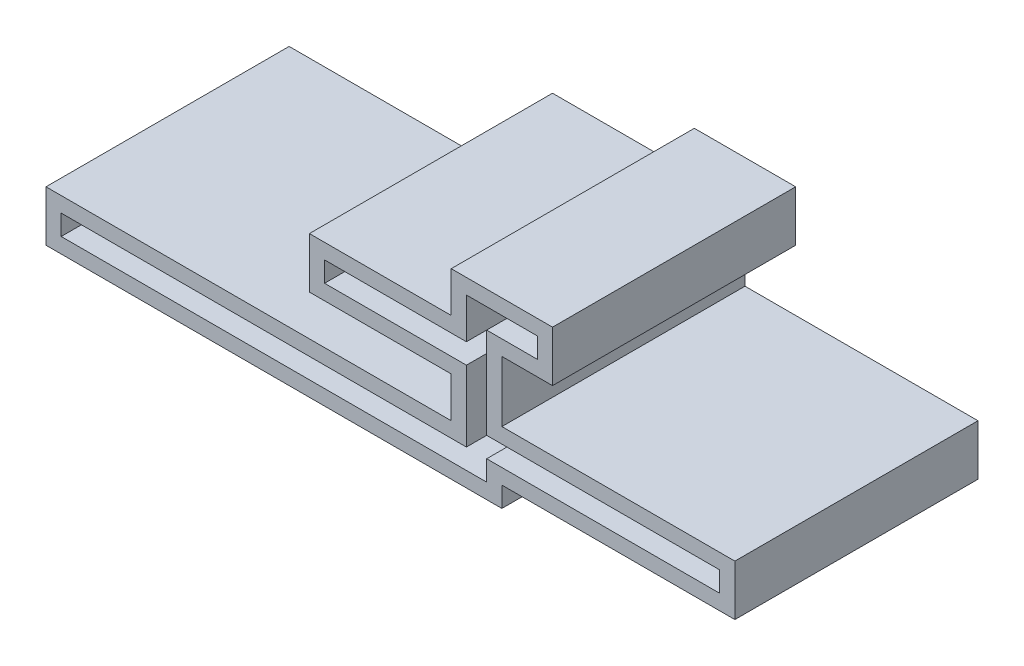
ISO-10303-21;
HEADER;
FILE_DESCRIPTION(('STEP AP214'),'2;1');
FILE_NAME('part.step','',(''),(''),'','','');
FILE_SCHEMA(('AUTOMOTIVE_DESIGN { 1 0 10303 214 1 1 1 1 }'));
ENDSEC;
DATA;
#1=APPLICATION_CONTEXT('core data for automotive mechanical design processes');
#2=APPLICATION_PROTOCOL_DEFINITION('international standard','automotive_design',2000,#1);
#3=PRODUCT_CONTEXT('',#1,'mechanical');
#4=PRODUCT('Part','Part','',(#3));
#5=PRODUCT_RELATED_PRODUCT_CATEGORY('part','',(#4));
#6=PRODUCT_DEFINITION_FORMATION('','',#4);
#7=PRODUCT_DEFINITION_CONTEXT('part definition',#1,'design');
#8=PRODUCT_DEFINITION('design','',#6,#7);
#9=PRODUCT_DEFINITION_SHAPE('','',#8);
#10=(LENGTH_UNIT() NAMED_UNIT(*) SI_UNIT(.MILLI.,.METRE.));
#11=(NAMED_UNIT(*) PLANE_ANGLE_UNIT() SI_UNIT($,.RADIAN.));
#12=(NAMED_UNIT(*) SI_UNIT($,.STERADIAN.) SOLID_ANGLE_UNIT());
#13=UNCERTAINTY_MEASURE_WITH_UNIT(LENGTH_MEASURE(1.E-05),#10,'distance_accuracy_value','');
#14=(GEOMETRIC_REPRESENTATION_CONTEXT(3) GLOBAL_UNCERTAINTY_ASSIGNED_CONTEXT((#13)) GLOBAL_UNIT_ASSIGNED_CONTEXT((#10,
#11,#12)) REPRESENTATION_CONTEXT('',''));
#15=CARTESIAN_POINT('',(0.,0.,0.));
#16=DIRECTION('',(0.,0.,1.));
#17=DIRECTION('',(1.,0.,0.));
#18=AXIS2_PLACEMENT_3D('',#15,#16,#17);
#19=CARTESIAN_POINT('',(-63.4999999999997,228.6,304.8));
#20=DIRECTION('',(1.,0.,0.));
#21=DIRECTION('',(0.,1.,0.));
#22=AXIS2_PLACEMENT_3D('',#19,#20,#21);
#23=PLANE('',#22);
#24=DIRECTION('',(0.,-1.,0.));
#25=VECTOR('',#24,1.);
#26=CARTESIAN_POINT('',(-63.4999999999997,228.6,0.));
#27=LINE('',#26,#25);
#28=CARTESIAN_POINT('',(-63.4999999999997,228.6,0.));
#29=VERTEX_POINT('',#28);
#30=CARTESIAN_POINT('',(-63.4999999999997,177.8,0.));
#31=VERTEX_POINT('',#30);
#32=EDGE_CURVE('E190',#29,#31,#27,.T.);
#33=ORIENTED_EDGE('',*,*,#32,.T.);
#34=DIRECTION('',(0.,0.,-1.));
#35=VECTOR('',#34,1.);
#36=CARTESIAN_POINT('',(-63.4999999999997,177.8,304.8));
#37=LINE('',#36,#35);
#38=CARTESIAN_POINT('',(-63.4999999999997,177.8,304.8));
#39=VERTEX_POINT('',#38);
#40=EDGE_CURVE('E11',#39,#31,#37,.T.);
#41=ORIENTED_EDGE('',*,*,#40,.F.);
#42=DIRECTION('',(0.,-1.,0.));
#43=VECTOR('',#42,1.);
#44=CARTESIAN_POINT('',(-63.4999999999997,228.6,304.8));
#45=LINE('',#44,#43);
#46=CARTESIAN_POINT('',(-63.4999999999997,228.6,304.8));
#47=VERTEX_POINT('',#46);
#48=EDGE_CURVE('E222',#47,#39,#45,.T.);
#49=ORIENTED_EDGE('',*,*,#48,.F.);
#50=DIRECTION('',(0.,0.,-1.));
#51=VECTOR('',#50,1.);
#52=CARTESIAN_POINT('',(-63.4999999999997,228.6,304.8));
#53=LINE('',#52,#51);
#54=EDGE_CURVE('E186',#47,#29,#53,.T.);
#55=ORIENTED_EDGE('',*,*,#54,.T.);
#56=EDGE_LOOP('',(#33,#41,#49,#55));
#57=FACE_BOUND('',#56,.T.);
#58=ADVANCED_FACE('F35',(#57),#23,.F.);
#59=CARTESIAN_POINT('',(-241.3,177.8,304.8));
#60=DIRECTION('',(0.,-1.,0.));
#61=DIRECTION('',(0.,0.,-1.));
#62=AXIS2_PLACEMENT_3D('',#59,#60,#61);
#63=PLANE('',#62);
#64=DIRECTION('',(-1.,0.,0.));
#65=VECTOR('',#64,1.);
#66=CARTESIAN_POINT('',(-241.3,177.8,0.));
#67=LINE('',#66,#65);
#68=CARTESIAN_POINT('',(-241.3,177.8,0.));
#69=VERTEX_POINT('',#68);
#70=EDGE_CURVE('E193',#31,#69,#67,.T.);
#71=ORIENTED_EDGE('',*,*,#70,.T.);
#72=DIRECTION('',(0.,0.,-1.));
#73=VECTOR('',#72,1.);
#74=CARTESIAN_POINT('',(-241.3,177.8,304.8));
#75=LINE('',#74,#73);
#76=CARTESIAN_POINT('',(-241.3,177.8,304.8));
#77=VERTEX_POINT('',#76);
#78=EDGE_CURVE('E42',#77,#69,#75,.T.);
#79=ORIENTED_EDGE('',*,*,#78,.F.);
#80=DIRECTION('',(-1.,0.,0.));
#81=VECTOR('',#80,1.);
#82=CARTESIAN_POINT('',(-241.3,177.8,304.8));
#83=LINE('',#82,#81);
#84=EDGE_CURVE('E123',#39,#77,#83,.T.);
#85=ORIENTED_EDGE('',*,*,#84,.F.);
#86=ORIENTED_EDGE('',*,*,#40,.T.);
#87=EDGE_LOOP('',(#71,#79,#85,#86));
#88=FACE_BOUND('',#87,.T.);
#89=ADVANCED_FACE('F553',(#88),#63,.F.);
#90=CARTESIAN_POINT('',(-241.3,114.3,304.8));
#91=DIRECTION('',(1.,0.,0.));
#92=DIRECTION('',(0.,0.,-1.));
#93=AXIS2_PLACEMENT_3D('',#90,#91,#92);
#94=PLANE('',#93);
#95=DIRECTION('',(0.,-1.,0.));
#96=VECTOR('',#95,1.);
#97=CARTESIAN_POINT('',(-241.3,114.3,0.));
#98=LINE('',#97,#96);
#99=CARTESIAN_POINT('',(-241.3,114.3,0.));
#100=VERTEX_POINT('',#99);
#101=EDGE_CURVE('E196',#69,#100,#98,.T.);
#102=ORIENTED_EDGE('',*,*,#101,.T.);
#103=DIRECTION('',(0.,0.,-1.));
#104=VECTOR('',#103,1.);
#105=CARTESIAN_POINT('',(-241.3,114.3,304.8));
#106=LINE('',#105,#104);
#107=CARTESIAN_POINT('',(-241.3,114.3,304.8));
#108=VERTEX_POINT('',#107);
#109=EDGE_CURVE('E253',#108,#100,#106,.T.);
#110=ORIENTED_EDGE('',*,*,#109,.F.);
#111=DIRECTION('',(0.,-1.,0.));
#112=VECTOR('',#111,1.);
#113=CARTESIAN_POINT('',(-241.3,114.3,304.8));
#114=LINE('',#113,#112);
#115=EDGE_CURVE('E261',#77,#108,#114,.T.);
#116=ORIENTED_EDGE('',*,*,#115,.F.);
#117=ORIENTED_EDGE('',*,*,#78,.T.);
#118=EDGE_LOOP('',(#102,#110,#116,#117));
#119=FACE_BOUND('',#118,.T.);
#120=ADVANCED_FACE('F259',(#119),#94,.F.);
#121=CARTESIAN_POINT('',(-63.5,114.3,304.8));
#122=DIRECTION('',(0.,1.,0.));
#123=DIRECTION('',(-1.,0.,0.));
#124=AXIS2_PLACEMENT_3D('',#121,#122,#123);
#125=PLANE('',#124);
#126=DIRECTION('',(1.,0.,0.));
#127=VECTOR('',#126,1.);
#128=CARTESIAN_POINT('',(-63.5,114.3,0.));
#129=LINE('',#128,#127);
#130=CARTESIAN_POINT('',(-63.5,114.3,0.));
#131=VERTEX_POINT('',#130);
#132=EDGE_CURVE('E198',#100,#131,#129,.T.);
#133=ORIENTED_EDGE('',*,*,#132,.T.);
#134=DIRECTION('',(0.,0.,-1.));
#135=VECTOR('',#134,1.);
#136=CARTESIAN_POINT('',(-63.5,114.3,304.8));
#137=LINE('',#136,#135);
#138=CARTESIAN_POINT('',(-63.5,114.3,304.8));
#139=VERTEX_POINT('',#138);
#140=EDGE_CURVE('E250',#139,#131,#137,.T.);
#141=ORIENTED_EDGE('',*,*,#140,.F.);
#142=DIRECTION('',(1.,0.,0.));
#143=VECTOR('',#142,1.);
#144=CARTESIAN_POINT('',(-63.5,114.3,304.8));
#145=LINE('',#144,#143);
#146=EDGE_CURVE('E279',#108,#139,#145,.T.);
#147=ORIENTED_EDGE('',*,*,#146,.F.);
#148=ORIENTED_EDGE('',*,*,#109,.T.);
#149=EDGE_LOOP('',(#133,#141,#147,#148));
#150=FACE_BOUND('',#149,.T.);
#151=ADVANCED_FACE('F270',(#150),#125,.F.);
#152=CARTESIAN_POINT('',(-63.5,63.4999999999999,304.8));
#153=DIRECTION('',(1.,0.,0.));
#154=DIRECTION('',(0.,1.,0.));
#155=AXIS2_PLACEMENT_3D('',#152,#153,#154);
#156=PLANE('',#155);
#157=DIRECTION('',(0.,-1.,0.));
#158=VECTOR('',#157,1.);
#159=CARTESIAN_POINT('',(-63.5,63.4999999999999,0.));
#160=LINE('',#159,#158);
#161=CARTESIAN_POINT('',(-63.5,63.4999999999999,0.));
#162=VERTEX_POINT('',#161);
#163=EDGE_CURVE('E200',#131,#162,#160,.T.);
#164=ORIENTED_EDGE('',*,*,#163,.T.);
#165=DIRECTION('',(0.,0.,-1.));
#166=VECTOR('',#165,1.);
#167=CARTESIAN_POINT('',(-63.5,63.4999999999999,304.8));
#168=LINE('',#167,#166);
#169=CARTESIAN_POINT('',(-63.5,63.4999999999999,304.8));
#170=VERTEX_POINT('',#169);
#171=EDGE_CURVE('E247',#170,#162,#168,.T.);
#172=ORIENTED_EDGE('',*,*,#171,.F.);
#173=DIRECTION('',(0.,-1.,0.));
#174=VECTOR('',#173,1.);
#175=CARTESIAN_POINT('',(-63.5,63.4999999999999,304.8));
#176=LINE('',#175,#174);
#177=EDGE_CURVE('E276',#139,#170,#176,.T.);
#178=ORIENTED_EDGE('',*,*,#177,.F.);
#179=ORIENTED_EDGE('',*,*,#140,.T.);
#180=EDGE_LOOP('',(#164,#172,#178,#179));
#181=FACE_BOUND('',#180,.T.);
#182=ADVANCED_FACE('F274',(#181),#156,.F.);
#183=CARTESIAN_POINT('',(-571.5,63.5,304.8));
#184=DIRECTION('',(0.,-1.,0.));
#185=DIRECTION('',(1.,0.,0.));
#186=AXIS2_PLACEMENT_3D('',#183,#184,#185);
#187=PLANE('',#186);
#188=DIRECTION('',(-1.,0.,0.));
#189=VECTOR('',#188,1.);
#190=CARTESIAN_POINT('',(-571.5,63.5,0.));
#191=LINE('',#190,#189);
#192=CARTESIAN_POINT('',(-571.5,63.5,0.));
#193=VERTEX_POINT('',#192);
#194=EDGE_CURVE('E202',#162,#193,#191,.T.);
#195=ORIENTED_EDGE('',*,*,#194,.T.);
#196=DIRECTION('',(0.,0.,-1.));
#197=VECTOR('',#196,1.);
#198=CARTESIAN_POINT('',(-571.5,63.5,304.8));
#199=LINE('',#198,#197);
#200=CARTESIAN_POINT('',(-571.5,63.5,304.8));
#201=VERTEX_POINT('',#200);
#202=EDGE_CURVE('E244',#201,#193,#199,.T.);
#203=ORIENTED_EDGE('',*,*,#202,.F.);
#204=DIRECTION('',(-1.,0.,0.));
#205=VECTOR('',#204,1.);
#206=CARTESIAN_POINT('',(-571.5,63.5,304.8));
#207=LINE('',#206,#205);
#208=EDGE_CURVE('E278',#170,#201,#207,.T.);
#209=ORIENTED_EDGE('',*,*,#208,.F.);
#210=ORIENTED_EDGE('',*,*,#171,.T.);
#211=EDGE_LOOP('',(#195,#203,#209,#210));
#212=FACE_BOUND('',#211,.T.);
#213=ADVANCED_FACE('F566',(#212),#187,.F.);
#214=CARTESIAN_POINT('',(-571.5,0.,304.8));
#215=DIRECTION('',(1.,0.,0.));
#216=DIRECTION('',(0.,0.,-1.));
#217=AXIS2_PLACEMENT_3D('',#214,#215,#216);
#218=PLANE('',#217);
#219=DIRECTION('',(0.,-1.,0.));
#220=VECTOR('',#219,1.);
#221=CARTESIAN_POINT('',(-571.5,0.,0.));
#222=LINE('',#221,#220);
#223=CARTESIAN_POINT('',(-571.5,0.,0.));
#224=VERTEX_POINT('',#223);
#225=EDGE_CURVE('E204',#193,#224,#222,.T.);
#226=ORIENTED_EDGE('',*,*,#225,.T.);
#227=DIRECTION('',(0.,0.,-1.));
#228=VECTOR('',#227,1.);
#229=CARTESIAN_POINT('',(-571.5,0.,304.8));
#230=LINE('',#229,#228);
#231=CARTESIAN_POINT('',(-571.5,0.,304.8));
#232=VERTEX_POINT('',#231);
#233=EDGE_CURVE('E241',#232,#224,#230,.T.);
#234=ORIENTED_EDGE('',*,*,#233,.F.);
#235=DIRECTION('',(0.,-1.,0.));
#236=VECTOR('',#235,1.);
#237=CARTESIAN_POINT('',(-571.5,0.,304.8));
#238=LINE('',#237,#236);
#239=EDGE_CURVE('E281',#201,#232,#238,.T.);
#240=ORIENTED_EDGE('',*,*,#239,.F.);
#241=ORIENTED_EDGE('',*,*,#202,.T.);
#242=EDGE_LOOP('',(#226,#234,#240,#241));
#243=FACE_BOUND('',#242,.T.);
#244=ADVANCED_FACE('F569',(#243),#218,.F.);
#245=CARTESIAN_POINT('',(0.,0.,304.8));
#246=DIRECTION('',(0.,1.,0.));
#247=DIRECTION('',(-1.,0.,0.));
#248=AXIS2_PLACEMENT_3D('',#245,#246,#247);
#249=PLANE('',#248);
#250=DIRECTION('',(1.,0.,0.));
#251=VECTOR('',#250,1.);
#252=CARTESIAN_POINT('',(0.,0.,0.));
#253=LINE('',#252,#251);
#254=CARTESIAN_POINT('',(0.,0.,0.));
#255=VERTEX_POINT('',#254);
#256=EDGE_CURVE('E206',#224,#255,#253,.T.);
#257=ORIENTED_EDGE('',*,*,#256,.T.);
#258=DIRECTION('',(0.,0.,-1.));
#259=VECTOR('',#258,1.);
#260=CARTESIAN_POINT('',(0.,0.,304.8));
#261=LINE('',#260,#259);
#262=CARTESIAN_POINT('',(0.,0.,304.8));
#263=VERTEX_POINT('',#262);
#264=EDGE_CURVE('E238',#263,#255,#261,.T.);
#265=ORIENTED_EDGE('',*,*,#264,.F.);
#266=DIRECTION('',(1.,0.,0.));
#267=VECTOR('',#266,1.);
#268=CARTESIAN_POINT('',(0.,0.,304.8));
#269=LINE('',#268,#267);
#270=EDGE_CURVE('E287',#232,#263,#269,.T.);
#271=ORIENTED_EDGE('',*,*,#270,.F.);
#272=ORIENTED_EDGE('',*,*,#233,.T.);
#273=EDGE_LOOP('',(#257,#265,#271,#272));
#274=FACE_BOUND('',#273,.T.);
#275=ADVANCED_FACE('F573',(#274),#249,.F.);
#276=CARTESIAN_POINT('',(2.61464941302539E-13,25.3999999999999,304.8));
#277=DIRECTION('',(-1.,0.,0.));
#278=DIRECTION('',(0.,-1.,0.));
#279=AXIS2_PLACEMENT_3D('',#276,#277,#278);
#280=PLANE('',#279);
#281=DIRECTION('',(0.,1.,0.));
#282=VECTOR('',#281,1.);
#283=CARTESIAN_POINT('',(2.61464941302539E-13,25.3999999999999,0.));
#284=LINE('',#283,#282);
#285=CARTESIAN_POINT('',(2.61464941302539E-13,25.3999999999999,0.));
#286=VERTEX_POINT('',#285);
#287=EDGE_CURVE('E208',#255,#286,#284,.T.);
#288=ORIENTED_EDGE('',*,*,#287,.T.);
#289=DIRECTION('',(0.,0.,-1.));
#290=VECTOR('',#289,1.);
#291=CARTESIAN_POINT('',(2.61464941302539E-13,25.3999999999999,304.8));
#292=LINE('',#291,#290);
#293=CARTESIAN_POINT('',(2.61464941302539E-13,25.3999999999999,304.8));
#294=VERTEX_POINT('',#293);
#295=EDGE_CURVE('E235',#294,#286,#292,.T.);
#296=ORIENTED_EDGE('',*,*,#295,.F.);
#297=DIRECTION('',(0.,1.,0.));
#298=VECTOR('',#297,1.);
#299=CARTESIAN_POINT('',(2.61464941302539E-13,25.3999999999999,304.8));
#300=LINE('',#299,#298);
#301=EDGE_CURVE('E289',#263,#294,#300,.T.);
#302=ORIENTED_EDGE('',*,*,#301,.F.);
#303=ORIENTED_EDGE('',*,*,#264,.T.);
#304=EDGE_LOOP('',(#288,#296,#302,#303));
#305=FACE_BOUND('',#304,.T.);
#306=ADVANCED_FACE('F577',(#305),#280,.F.);
#307=CARTESIAN_POINT('',(292.1,25.3999999999999,304.8));
#308=DIRECTION('',(0.,1.,0.));
#309=DIRECTION('',(-1.,0.,0.));
#310=AXIS2_PLACEMENT_3D('',#307,#308,#309);
#311=PLANE('',#310);
#312=DIRECTION('',(1.,0.,0.));
#313=VECTOR('',#312,1.);
#314=CARTESIAN_POINT('',(292.1,25.3999999999999,0.));
#315=LINE('',#314,#313);
#316=CARTESIAN_POINT('',(292.1,25.3999999999999,0.));
#317=VERTEX_POINT('',#316);
#318=EDGE_CURVE('E210',#286,#317,#315,.T.);
#319=ORIENTED_EDGE('',*,*,#318,.T.);
#320=DIRECTION('',(0.,0.,-1.));
#321=VECTOR('',#320,1.);
#322=CARTESIAN_POINT('',(292.1,25.3999999999999,304.8));
#323=LINE('',#322,#321);
#324=CARTESIAN_POINT('',(292.1,25.3999999999999,304.8));
#325=VERTEX_POINT('',#324);
#326=EDGE_CURVE('E232',#325,#317,#323,.T.);
#327=ORIENTED_EDGE('',*,*,#326,.F.);
#328=DIRECTION('',(1.,0.,0.));
#329=VECTOR('',#328,1.);
#330=CARTESIAN_POINT('',(292.1,25.3999999999999,304.8));
#331=LINE('',#330,#329);
#332=EDGE_CURVE('E291',#294,#325,#331,.T.);
#333=ORIENTED_EDGE('',*,*,#332,.F.);
#334=ORIENTED_EDGE('',*,*,#295,.T.);
#335=EDGE_LOOP('',(#319,#327,#333,#334));
#336=FACE_BOUND('',#335,.T.);
#337=ADVANCED_FACE('F581',(#336),#311,.F.);
#338=CARTESIAN_POINT('',(292.1,88.8999999999999,304.8));
#339=DIRECTION('',(-1.,0.,0.));
#340=DIRECTION('',(0.,-1.,0.));
#341=AXIS2_PLACEMENT_3D('',#338,#339,#340);
#342=PLANE('',#341);
#343=DIRECTION('',(0.,1.,0.));
#344=VECTOR('',#343,1.);
#345=CARTESIAN_POINT('',(292.1,88.8999999999999,0.));
#346=LINE('',#345,#344);
#347=CARTESIAN_POINT('',(292.1,88.8999999999999,0.));
#348=VERTEX_POINT('',#347);
#349=EDGE_CURVE('E212',#317,#348,#346,.T.);
#350=ORIENTED_EDGE('',*,*,#349,.T.);
#351=DIRECTION('',(0.,0.,-1.));
#352=VECTOR('',#351,1.);
#353=CARTESIAN_POINT('',(292.1,88.8999999999999,304.8));
#354=LINE('',#353,#352);
#355=CARTESIAN_POINT('',(292.1,88.8999999999999,304.8));
#356=VERTEX_POINT('',#355);
#357=EDGE_CURVE('E229',#356,#348,#354,.T.);
#358=ORIENTED_EDGE('',*,*,#357,.F.);
#359=DIRECTION('',(0.,1.,0.));
#360=VECTOR('',#359,1.);
#361=CARTESIAN_POINT('',(292.1,88.8999999999999,304.8));
#362=LINE('',#361,#360);
#363=EDGE_CURVE('E293',#325,#356,#362,.T.);
#364=ORIENTED_EDGE('',*,*,#363,.F.);
#365=ORIENTED_EDGE('',*,*,#326,.T.);
#366=EDGE_LOOP('',(#350,#358,#364,#365));
#367=FACE_BOUND('',#366,.T.);
#368=ADVANCED_FACE('F585',(#367),#342,.F.);
#369=CARTESIAN_POINT('',(2.53688434127953E-13,88.8999999999999,304.8));
#370=DIRECTION('',(0.,-1.,0.));
#371=DIRECTION('',(1.,0.,0.));
#372=AXIS2_PLACEMENT_3D('',#369,#370,#371);
#373=PLANE('',#372);
#374=DIRECTION('',(-1.,0.,0.));
#375=VECTOR('',#374,1.);
#376=CARTESIAN_POINT('',(2.53688434127953E-13,88.8999999999999,0.));
#377=LINE('',#376,#375);
#378=CARTESIAN_POINT('',(2.53688434127953E-13,88.8999999999999,0.));
#379=VERTEX_POINT('',#378);
#380=EDGE_CURVE('E214',#348,#379,#377,.T.);
#381=ORIENTED_EDGE('',*,*,#380,.T.);
#382=DIRECTION('',(0.,0.,-1.));
#383=VECTOR('',#382,1.);
#384=CARTESIAN_POINT('',(2.53688434127953E-13,88.8999999999999,304.8));
#385=LINE('',#384,#383);
#386=CARTESIAN_POINT('',(2.53688434127953E-13,88.8999999999999,304.8));
#387=VERTEX_POINT('',#386);
#388=EDGE_CURVE('E226',#387,#379,#385,.T.);
#389=ORIENTED_EDGE('',*,*,#388,.F.);
#390=DIRECTION('',(-1.,0.,0.));
#391=VECTOR('',#390,1.);
#392=CARTESIAN_POINT('',(2.53688434127953E-13,88.8999999999999,304.8));
#393=LINE('',#392,#391);
#394=EDGE_CURVE('E295',#356,#387,#393,.T.);
#395=ORIENTED_EDGE('',*,*,#394,.F.);
#396=ORIENTED_EDGE('',*,*,#357,.T.);
#397=EDGE_LOOP('',(#381,#389,#395,#396));
#398=FACE_BOUND('',#397,.T.);
#399=ADVANCED_FACE('F301',(#398),#373,.F.);
#400=CARTESIAN_POINT('',(2.4435662551845E-13,165.1,304.8));
#401=DIRECTION('',(-1.,0.,0.));
#402=DIRECTION('',(0.,-1.,0.));
#403=AXIS2_PLACEMENT_3D('',#400,#401,#402);
#404=PLANE('',#403);
#405=DIRECTION('',(0.,1.,0.));
#406=VECTOR('',#405,1.);
#407=CARTESIAN_POINT('',(2.4435662551845E-13,165.1,0.));
#408=LINE('',#407,#406);
#409=CARTESIAN_POINT('',(2.4435662551845E-13,165.1,0.));
#410=VERTEX_POINT('',#409);
#411=EDGE_CURVE('E216',#379,#410,#408,.T.);
#412=ORIENTED_EDGE('',*,*,#411,.T.);
#413=DIRECTION('',(0.,0.,-1.));
#414=VECTOR('',#413,1.);
#415=CARTESIAN_POINT('',(2.4435662551845E-13,165.1,304.8));
#416=LINE('',#415,#414);
#417=CARTESIAN_POINT('',(2.4435662551845E-13,165.1,304.8));
#418=VERTEX_POINT('',#417);
#419=EDGE_CURVE('E181',#418,#410,#416,.T.);
#420=ORIENTED_EDGE('',*,*,#419,.F.);
#421=DIRECTION('',(0.,1.,0.));
#422=VECTOR('',#421,1.);
#423=CARTESIAN_POINT('',(2.4435662551845E-13,165.1,304.8));
#424=LINE('',#423,#422);
#425=EDGE_CURVE('E169',#387,#418,#424,.T.);
#426=ORIENTED_EDGE('',*,*,#425,.F.);
#427=ORIENTED_EDGE('',*,*,#388,.T.);
#428=EDGE_LOOP('',(#412,#420,#426,#427));
#429=FACE_BOUND('',#428,.T.);
#430=ADVANCED_FACE('F305',(#429),#404,.F.);
#431=CARTESIAN_POINT('',(63.5000000000003,165.1,304.8));
#432=DIRECTION('',(0.,1.,0.));
#433=DIRECTION('',(-1.,0.,0.));
#434=AXIS2_PLACEMENT_3D('',#431,#432,#433);
#435=PLANE('',#434);
#436=DIRECTION('',(1.,0.,0.));
#437=VECTOR('',#436,1.);
#438=CARTESIAN_POINT('',(63.5000000000003,165.1,0.));
#439=LINE('',#438,#437);
#440=CARTESIAN_POINT('',(63.5000000000003,165.1,0.));
#441=VERTEX_POINT('',#440);
#442=EDGE_CURVE('E178',#410,#441,#439,.T.);
#443=ORIENTED_EDGE('',*,*,#442,.T.);
#444=DIRECTION('',(0.,0.,-1.));
#445=VECTOR('',#444,1.);
#446=CARTESIAN_POINT('',(63.5000000000003,165.1,304.8));
#447=LINE('',#446,#445);
#448=CARTESIAN_POINT('',(63.5000000000003,165.1,304.8));
#449=VERTEX_POINT('',#448);
#450=EDGE_CURVE('E175',#449,#441,#447,.T.);
#451=ORIENTED_EDGE('',*,*,#450,.F.);
#452=DIRECTION('',(1.,0.,0.));
#453=VECTOR('',#452,1.);
#454=CARTESIAN_POINT('',(63.5000000000003,165.1,304.8));
#455=LINE('',#454,#453);
#456=EDGE_CURVE('E162',#418,#449,#455,.T.);
#457=ORIENTED_EDGE('',*,*,#456,.F.);
#458=ORIENTED_EDGE('',*,*,#419,.T.);
#459=EDGE_LOOP('',(#443,#451,#457,#458));
#460=FACE_BOUND('',#459,.T.);
#461=ADVANCED_FACE('F176',(#460),#435,.F.);
#462=CARTESIAN_POINT('',(63.5000000000003,228.6,304.8));
#463=DIRECTION('',(-1.,0.,0.));
#464=DIRECTION('',(0.,-1.,0.));
#465=AXIS2_PLACEMENT_3D('',#462,#463,#464);
#466=PLANE('',#465);
#467=DIRECTION('',(0.,1.,0.));
#468=VECTOR('',#467,1.);
#469=CARTESIAN_POINT('',(63.5000000000003,228.6,0.));
#470=LINE('',#469,#468);
#471=CARTESIAN_POINT('',(63.5000000000003,228.6,0.));
#472=VERTEX_POINT('',#471);
#473=EDGE_CURVE('E219',#441,#472,#470,.T.);
#474=ORIENTED_EDGE('',*,*,#473,.T.);
#475=DIRECTION('',(0.,0.,-1.));
#476=VECTOR('',#475,1.);
#477=CARTESIAN_POINT('',(63.5000000000003,228.6,304.8));
#478=LINE('',#477,#476);
#479=CARTESIAN_POINT('',(63.5000000000003,228.6,304.8));
#480=VERTEX_POINT('',#479);
#481=EDGE_CURVE('E182',#480,#472,#478,.T.);
#482=ORIENTED_EDGE('',*,*,#481,.F.);
#483=DIRECTION('',(0.,1.,0.));
#484=VECTOR('',#483,1.);
#485=CARTESIAN_POINT('',(63.5000000000003,228.6,304.8));
#486=LINE('',#485,#484);
#487=EDGE_CURVE('E166',#449,#480,#486,.T.);
#488=ORIENTED_EDGE('',*,*,#487,.F.);
#489=ORIENTED_EDGE('',*,*,#450,.T.);
#490=EDGE_LOOP('',(#474,#482,#488,#489));
#491=FACE_BOUND('',#490,.T.);
#492=ADVANCED_FACE('F184',(#491),#466,.F.);
#493=CARTESIAN_POINT('',(-63.4999999999997,228.6,304.8));
#494=DIRECTION('',(0.,-1.,0.));
#495=DIRECTION('',(0.,0.,-1.));
#496=AXIS2_PLACEMENT_3D('',#493,#494,#495);
#497=PLANE('',#496);
#498=DIRECTION('',(-1.,0.,0.));
#499=VECTOR('',#498,1.);
#500=CARTESIAN_POINT('',(-63.4999999999997,228.6,0.));
#501=LINE('',#500,#499);
#502=EDGE_CURVE('E115',#472,#29,#501,.T.);
#503=ORIENTED_EDGE('',*,*,#502,.T.);
#504=ORIENTED_EDGE('',*,*,#54,.F.);
#505=DIRECTION('',(-1.,0.,0.));
#506=VECTOR('',#505,1.);
#507=CARTESIAN_POINT('',(-63.4999999999997,228.6,304.8));
#508=LINE('',#507,#506);
#509=EDGE_CURVE('E58',#480,#47,#508,.T.);
#510=ORIENTED_EDGE('',*,*,#509,.F.);
#511=ORIENTED_EDGE('',*,*,#481,.T.);
#512=EDGE_LOOP('',(#503,#504,#510,#511));
#513=FACE_BOUND('',#512,.T.);
#514=ADVANCED_FACE('F306',(#513),#497,.F.);
#515=CARTESIAN_POINT('',(0.,0.,304.8));
#516=DIRECTION('',(0.,0.,1.));
#517=DIRECTION('',(1.,0.,0.));
#518=AXIS2_PLACEMENT_3D('',#515,#516,#517);
#519=PLANE('',#518);
#520=DIRECTION('',(0.,-1.,0.));
#521=VECTOR('',#520,1.);
#522=CARTESIAN_POINT('',(-44.4499999999997,228.6,304.8));
#523=LINE('',#522,#521);
#524=CARTESIAN_POINT('',(-44.4499999999997,209.55,304.8));
#525=VERTEX_POINT('',#524);
#526=CARTESIAN_POINT('',(-44.4499999999997,158.75,304.8));
#527=VERTEX_POINT('',#526);
#528=EDGE_CURVE('E357',#525,#527,#523,.T.);
#529=ORIENTED_EDGE('',*,*,#528,.F.);
#530=DIRECTION('',(-1.,0.,0.));
#531=VECTOR('',#530,1.);
#532=CARTESIAN_POINT('',(-63.4999999999997,209.55,304.8));
#533=LINE('',#532,#531);
#534=CARTESIAN_POINT('',(44.4500000000003,209.55,304.8));
#535=VERTEX_POINT('',#534);
#536=EDGE_CURVE('E313',#535,#525,#533,.T.);
#537=ORIENTED_EDGE('',*,*,#536,.F.);
#538=DIRECTION('',(0.,1.,0.));
#539=VECTOR('',#538,1.);
#540=CARTESIAN_POINT('',(44.4500000000003,228.6,304.8));
#541=LINE('',#540,#539);
#542=CARTESIAN_POINT('',(44.4500000000003,184.15,304.8));
#543=VERTEX_POINT('',#542);
#544=EDGE_CURVE('E316',#543,#535,#541,.T.);
#545=ORIENTED_EDGE('',*,*,#544,.F.);
#546=DIRECTION('',(1.,0.,0.));
#547=VECTOR('',#546,1.);
#548=CARTESIAN_POINT('',(63.5000000000003,184.15,304.8));
#549=LINE('',#548,#547);
#550=CARTESIAN_POINT('',(-19.0499999999998,184.15,304.8));
#551=VERTEX_POINT('',#550);
#552=EDGE_CURVE('E318',#551,#543,#549,.T.);
#553=ORIENTED_EDGE('',*,*,#552,.F.);
#554=DIRECTION('',(0.,1.,0.));
#555=VECTOR('',#554,1.);
#556=CARTESIAN_POINT('',(-19.0499999999998,165.1,304.8));
#557=LINE('',#556,#555);
#558=CARTESIAN_POINT('',(-19.0499999999997,69.8499999999999,304.8));
#559=VERTEX_POINT('',#558);
#560=EDGE_CURVE('E321',#559,#551,#557,.T.);
#561=ORIENTED_EDGE('',*,*,#560,.F.);
#562=DIRECTION('',(-1.,0.,0.));
#563=VECTOR('',#562,1.);
#564=CARTESIAN_POINT('',(2.54593507245854E-13,69.8499999999999,304.8));
#565=LINE('',#564,#563);
#566=CARTESIAN_POINT('',(273.05,69.85,304.8));
#567=VERTEX_POINT('',#566);
#568=EDGE_CURVE('E324',#567,#559,#565,.T.);
#569=ORIENTED_EDGE('',*,*,#568,.F.);
#570=DIRECTION('',(0.,1.,0.));
#571=VECTOR('',#570,1.);
#572=CARTESIAN_POINT('',(273.05,88.8999999999999,304.8));
#573=LINE('',#572,#571);
#574=CARTESIAN_POINT('',(273.05,44.4499999999999,304.8));
#575=VERTEX_POINT('',#574);
#576=EDGE_CURVE('E327',#575,#567,#573,.T.);
#577=ORIENTED_EDGE('',*,*,#576,.F.);
#578=DIRECTION('',(1.,0.,0.));
#579=VECTOR('',#578,1.);
#580=CARTESIAN_POINT('',(292.1,44.4499999999999,304.8));
#581=LINE('',#580,#579);
#582=CARTESIAN_POINT('',(-19.0499999999995,44.4499999999999,304.8));
#583=VERTEX_POINT('',#582);
#584=EDGE_CURVE('E330',#583,#575,#581,.T.);
#585=ORIENTED_EDGE('',*,*,#584,.F.);
#586=DIRECTION('',(0.,1.,0.));
#587=VECTOR('',#586,1.);
#588=CARTESIAN_POINT('',(-19.0499999999997,25.4000000000001,304.8));
#589=LINE('',#588,#587);
#590=CARTESIAN_POINT('',(-19.0499999999998,19.05,304.8));
#591=VERTEX_POINT('',#590);
#592=EDGE_CURVE('E333',#591,#583,#589,.T.);
#593=ORIENTED_EDGE('',*,*,#592,.F.);
#594=DIRECTION('',(1.,0.,0.));
#595=VECTOR('',#594,1.);
#596=CARTESIAN_POINT('',(0.,19.05,304.8));
#597=LINE('',#596,#595);
#598=CARTESIAN_POINT('',(-552.45,19.05,304.8));
#599=VERTEX_POINT('',#598);
#600=EDGE_CURVE('E336',#599,#591,#597,.T.);
#601=ORIENTED_EDGE('',*,*,#600,.F.);
#602=DIRECTION('',(0.,-1.,0.));
#603=VECTOR('',#602,1.);
#604=CARTESIAN_POINT('',(-552.45,0.,304.8));
#605=LINE('',#604,#603);
#606=CARTESIAN_POINT('',(-552.45,44.45,304.8));
#607=VERTEX_POINT('',#606);
#608=EDGE_CURVE('E339',#607,#599,#605,.T.);
#609=ORIENTED_EDGE('',*,*,#608,.F.);
#610=DIRECTION('',(-1.,0.,0.));
#611=VECTOR('',#610,1.);
#612=CARTESIAN_POINT('',(-571.5,44.45,304.8));
#613=LINE('',#612,#611);
#614=CARTESIAN_POINT('',(-44.45,44.4499999999999,304.8));
#615=VERTEX_POINT('',#614);
#616=EDGE_CURVE('E342',#615,#607,#613,.T.);
#617=ORIENTED_EDGE('',*,*,#616,.F.);
#618=DIRECTION('',(0.,-1.,0.));
#619=VECTOR('',#618,1.);
#620=CARTESIAN_POINT('',(-44.45,63.4999999999999,304.8));
#621=LINE('',#620,#619);
#622=CARTESIAN_POINT('',(-44.45,133.35,304.8));
#623=VERTEX_POINT('',#622);
#624=EDGE_CURVE('E345',#623,#615,#621,.T.);
#625=ORIENTED_EDGE('',*,*,#624,.F.);
#626=DIRECTION('',(1.,0.,0.));
#627=VECTOR('',#626,1.);
#628=CARTESIAN_POINT('',(-63.5,133.35,304.8));
#629=LINE('',#628,#627);
#630=CARTESIAN_POINT('',(-222.25,133.35,304.8));
#631=VERTEX_POINT('',#630);
#632=EDGE_CURVE('E348',#631,#623,#629,.T.);
#633=ORIENTED_EDGE('',*,*,#632,.F.);
#634=DIRECTION('',(0.,-1.,0.));
#635=VECTOR('',#634,1.);
#636=CARTESIAN_POINT('',(-222.25,114.3,304.8));
#637=LINE('',#636,#635);
#638=CARTESIAN_POINT('',(-222.25,158.75,304.8));
#639=VERTEX_POINT('',#638);
#640=EDGE_CURVE('E351',#639,#631,#637,.T.);
#641=ORIENTED_EDGE('',*,*,#640,.F.);
#642=DIRECTION('',(-1.,0.,0.));
#643=VECTOR('',#642,1.);
#644=CARTESIAN_POINT('',(-241.3,158.75,304.8));
#645=LINE('',#644,#643);
#646=EDGE_CURVE('E354',#527,#639,#645,.T.);
#647=ORIENTED_EDGE('',*,*,#646,.F.);
#648=EDGE_LOOP('',(#529,#537,#545,#553,#561,#569,#577,#585,#593,#601,#609,#617,#625,#633,#641,#647));
#649=FACE_BOUND('',#648,.T.);
#650=ORIENTED_EDGE('',*,*,#48,.T.);
#651=ORIENTED_EDGE('',*,*,#84,.T.);
#652=ORIENTED_EDGE('',*,*,#115,.T.);
#653=ORIENTED_EDGE('',*,*,#146,.T.);
#654=ORIENTED_EDGE('',*,*,#177,.T.);
#655=ORIENTED_EDGE('',*,*,#208,.T.);
#656=ORIENTED_EDGE('',*,*,#239,.T.);
#657=ORIENTED_EDGE('',*,*,#270,.T.);
#658=ORIENTED_EDGE('',*,*,#301,.T.);
#659=ORIENTED_EDGE('',*,*,#332,.T.);
#660=ORIENTED_EDGE('',*,*,#363,.T.);
#661=ORIENTED_EDGE('',*,*,#394,.T.);
#662=ORIENTED_EDGE('',*,*,#425,.T.);
#663=ORIENTED_EDGE('',*,*,#456,.T.);
#664=ORIENTED_EDGE('',*,*,#487,.T.);
#665=ORIENTED_EDGE('',*,*,#509,.T.);
#666=EDGE_LOOP('',(#650,#651,#652,#653,#654,#655,#656,#657,#658,#659,#660,#661,#662,#663,#664,#665));
#667=FACE_BOUND('',#666,.T.);
#668=ADVANCED_FACE('F164',(#649,#667),#519,.T.);
#669=CARTESIAN_POINT('',(0.,0.,0.));
#670=DIRECTION('',(0.,0.,1.));
#671=DIRECTION('',(1.,0.,0.));
#672=AXIS2_PLACEMENT_3D('',#669,#670,#671);
#673=PLANE('',#672);
#674=ORIENTED_EDGE('',*,*,#32,.F.);
#675=ORIENTED_EDGE('',*,*,#502,.F.);
#676=ORIENTED_EDGE('',*,*,#473,.F.);
#677=ORIENTED_EDGE('',*,*,#442,.F.);
#678=ORIENTED_EDGE('',*,*,#411,.F.);
#679=ORIENTED_EDGE('',*,*,#380,.F.);
#680=ORIENTED_EDGE('',*,*,#349,.F.);
#681=ORIENTED_EDGE('',*,*,#318,.F.);
#682=ORIENTED_EDGE('',*,*,#287,.F.);
#683=ORIENTED_EDGE('',*,*,#256,.F.);
#684=ORIENTED_EDGE('',*,*,#225,.F.);
#685=ORIENTED_EDGE('',*,*,#194,.F.);
#686=ORIENTED_EDGE('',*,*,#163,.F.);
#687=ORIENTED_EDGE('',*,*,#132,.F.);
#688=ORIENTED_EDGE('',*,*,#101,.F.);
#689=ORIENTED_EDGE('',*,*,#70,.F.);
#690=EDGE_LOOP('',(#674,#675,#676,#677,#678,#679,#680,#681,#682,#683,#684,#685,#686,#687,#688,#689));
#691=FACE_BOUND('',#690,.T.);
#692=ADVANCED_FACE('F265',(#691),#673,.F.);
#693=CARTESIAN_POINT('',(-44.4499999999997,228.6,304.8));
#694=DIRECTION('',(1.,0.,0.));
#695=DIRECTION('',(0.,1.,0.));
#696=AXIS2_PLACEMENT_3D('',#693,#694,#695);
#697=PLANE('',#696);
#698=DIRECTION('',(0.,-1.,0.));
#699=VECTOR('',#698,1.);
#700=CARTESIAN_POINT('',(-44.4499999999997,228.6,19.05));
#701=LINE('',#700,#699);
#702=CARTESIAN_POINT('',(-44.4499999999997,209.55,19.05));
#703=VERTEX_POINT('',#702);
#704=CARTESIAN_POINT('',(-44.4499999999997,158.75,19.05));
#705=VERTEX_POINT('',#704);
#706=EDGE_CURVE('E445',#703,#705,#701,.T.);
#707=ORIENTED_EDGE('',*,*,#706,.F.);
#708=DIRECTION('',(0.,0.,-1.));
#709=VECTOR('',#708,1.);
#710=CARTESIAN_POINT('',(-44.4499999999997,209.55,304.8));
#711=LINE('',#710,#709);
#712=EDGE_CURVE('E315',#525,#703,#711,.T.);
#713=ORIENTED_EDGE('',*,*,#712,.F.);
#714=ORIENTED_EDGE('',*,*,#528,.T.);
#715=DIRECTION('',(0.,0.,-1.));
#716=VECTOR('',#715,1.);
#717=CARTESIAN_POINT('',(-44.4499999999997,158.75,304.8));
#718=LINE('',#717,#716);
#719=EDGE_CURVE('E194',#527,#705,#718,.T.);
#720=ORIENTED_EDGE('',*,*,#719,.T.);
#721=EDGE_LOOP('',(#707,#713,#714,#720));
#722=FACE_BOUND('',#721,.T.);
#723=ADVANCED_FACE('F461',(#722),#697,.T.);
#724=CARTESIAN_POINT('',(-241.3,158.75,304.8));
#725=DIRECTION('',(0.,-1.,0.));
#726=DIRECTION('',(0.,0.,-1.));
#727=AXIS2_PLACEMENT_3D('',#724,#725,#726);
#728=PLANE('',#727);
#729=DIRECTION('',(-1.,0.,0.));
#730=VECTOR('',#729,1.);
#731=CARTESIAN_POINT('',(-241.3,158.75,19.05));
#732=LINE('',#731,#730);
#733=CARTESIAN_POINT('',(-222.25,158.75,19.05));
#734=VERTEX_POINT('',#733);
#735=EDGE_CURVE('E440',#705,#734,#732,.T.);
#736=ORIENTED_EDGE('',*,*,#735,.F.);
#737=ORIENTED_EDGE('',*,*,#719,.F.);
#738=ORIENTED_EDGE('',*,*,#646,.T.);
#739=DIRECTION('',(0.,0.,-1.));
#740=VECTOR('',#739,1.);
#741=CARTESIAN_POINT('',(-222.25,158.75,304.8));
#742=LINE('',#741,#740);
#743=EDGE_CURVE('E437',#639,#734,#742,.T.);
#744=ORIENTED_EDGE('',*,*,#743,.T.);
#745=EDGE_LOOP('',(#736,#737,#738,#744));
#746=FACE_BOUND('',#745,.T.);
#747=ADVANCED_FACE('F507',(#746),#728,.T.);
#748=CARTESIAN_POINT('',(-222.25,114.3,304.8));
#749=DIRECTION('',(1.,0.,0.));
#750=DIRECTION('',(0.,0.,-1.));
#751=AXIS2_PLACEMENT_3D('',#748,#749,#750);
#752=PLANE('',#751);
#753=DIRECTION('',(0.,-1.,0.));
#754=VECTOR('',#753,1.);
#755=CARTESIAN_POINT('',(-222.25,114.3,19.05));
#756=LINE('',#755,#754);
#757=CARTESIAN_POINT('',(-222.25,133.35,19.05));
#758=VERTEX_POINT('',#757);
#759=EDGE_CURVE('E434',#734,#758,#756,.T.);
#760=ORIENTED_EDGE('',*,*,#759,.F.);
#761=ORIENTED_EDGE('',*,*,#743,.F.);
#762=ORIENTED_EDGE('',*,*,#640,.T.);
#763=DIRECTION('',(0.,0.,-1.));
#764=VECTOR('',#763,1.);
#765=CARTESIAN_POINT('',(-222.25,133.35,304.8));
#766=LINE('',#765,#764);
#767=EDGE_CURVE('E431',#631,#758,#766,.T.);
#768=ORIENTED_EDGE('',*,*,#767,.T.);
#769=EDGE_LOOP('',(#760,#761,#762,#768));
#770=FACE_BOUND('',#769,.T.);
#771=ADVANCED_FACE('F513',(#770),#752,.T.);
#772=CARTESIAN_POINT('',(-63.5,133.35,304.8));
#773=DIRECTION('',(0.,1.,0.));
#774=DIRECTION('',(-1.,0.,0.));
#775=AXIS2_PLACEMENT_3D('',#772,#773,#774);
#776=PLANE('',#775);
#777=DIRECTION('',(1.,0.,0.));
#778=VECTOR('',#777,1.);
#779=CARTESIAN_POINT('',(-63.5,133.35,19.05));
#780=LINE('',#779,#778);
#781=CARTESIAN_POINT('',(-44.45,133.35,19.05));
#782=VERTEX_POINT('',#781);
#783=EDGE_CURVE('E428',#758,#782,#780,.T.);
#784=ORIENTED_EDGE('',*,*,#783,.F.);
#785=ORIENTED_EDGE('',*,*,#767,.F.);
#786=ORIENTED_EDGE('',*,*,#632,.T.);
#787=DIRECTION('',(0.,0.,-1.));
#788=VECTOR('',#787,1.);
#789=CARTESIAN_POINT('',(-44.45,133.35,304.8));
#790=LINE('',#789,#788);
#791=EDGE_CURVE('E425',#623,#782,#790,.T.);
#792=ORIENTED_EDGE('',*,*,#791,.T.);
#793=EDGE_LOOP('',(#784,#785,#786,#792));
#794=FACE_BOUND('',#793,.T.);
#795=ADVANCED_FACE('F710',(#794),#776,.T.);
#796=CARTESIAN_POINT('',(-44.45,63.4999999999999,304.8));
#797=DIRECTION('',(1.,0.,0.));
#798=DIRECTION('',(0.,1.,0.));
#799=AXIS2_PLACEMENT_3D('',#796,#797,#798);
#800=PLANE('',#799);
#801=DIRECTION('',(0.,-1.,0.));
#802=VECTOR('',#801,1.);
#803=CARTESIAN_POINT('',(-44.45,63.4999999999999,19.05));
#804=LINE('',#803,#802);
#805=CARTESIAN_POINT('',(-44.45,44.4499999999999,19.05));
#806=VERTEX_POINT('',#805);
#807=EDGE_CURVE('E422',#782,#806,#804,.T.);
#808=ORIENTED_EDGE('',*,*,#807,.F.);
#809=ORIENTED_EDGE('',*,*,#791,.F.);
#810=ORIENTED_EDGE('',*,*,#624,.T.);
#811=DIRECTION('',(0.,0.,-1.));
#812=VECTOR('',#811,1.);
#813=CARTESIAN_POINT('',(-44.45,44.4499999999999,304.8));
#814=LINE('',#813,#812);
#815=EDGE_CURVE('E419',#615,#806,#814,.T.);
#816=ORIENTED_EDGE('',*,*,#815,.T.);
#817=EDGE_LOOP('',(#808,#809,#810,#816));
#818=FACE_BOUND('',#817,.T.);
#819=ADVANCED_FACE('F700',(#818),#800,.T.);
#820=CARTESIAN_POINT('',(-571.5,44.45,304.8));
#821=DIRECTION('',(0.,-1.,0.));
#822=DIRECTION('',(1.,0.,0.));
#823=AXIS2_PLACEMENT_3D('',#820,#821,#822);
#824=PLANE('',#823);
#825=DIRECTION('',(-1.,0.,0.));
#826=VECTOR('',#825,1.);
#827=CARTESIAN_POINT('',(-571.5,44.45,19.05));
#828=LINE('',#827,#826);
#829=CARTESIAN_POINT('',(-552.45,44.45,19.05));
#830=VERTEX_POINT('',#829);
#831=EDGE_CURVE('E416',#806,#830,#828,.T.);
#832=ORIENTED_EDGE('',*,*,#831,.F.);
#833=ORIENTED_EDGE('',*,*,#815,.F.);
#834=ORIENTED_EDGE('',*,*,#616,.T.);
#835=DIRECTION('',(0.,0.,-1.));
#836=VECTOR('',#835,1.);
#837=CARTESIAN_POINT('',(-552.45,44.45,304.8));
#838=LINE('',#837,#836);
#839=EDGE_CURVE('E413',#607,#830,#838,.T.);
#840=ORIENTED_EDGE('',*,*,#839,.T.);
#841=EDGE_LOOP('',(#832,#833,#834,#840));
#842=FACE_BOUND('',#841,.T.);
#843=ADVANCED_FACE('F690',(#842),#824,.T.);
#844=CARTESIAN_POINT('',(-552.45,0.,304.8));
#845=DIRECTION('',(1.,0.,0.));
#846=DIRECTION('',(0.,0.,-1.));
#847=AXIS2_PLACEMENT_3D('',#844,#845,#846);
#848=PLANE('',#847);
#849=DIRECTION('',(0.,-1.,0.));
#850=VECTOR('',#849,1.);
#851=CARTESIAN_POINT('',(-552.45,0.,19.05));
#852=LINE('',#851,#850);
#853=CARTESIAN_POINT('',(-552.45,19.05,19.05));
#854=VERTEX_POINT('',#853);
#855=EDGE_CURVE('E410',#830,#854,#852,.T.);
#856=ORIENTED_EDGE('',*,*,#855,.F.);
#857=ORIENTED_EDGE('',*,*,#839,.F.);
#858=ORIENTED_EDGE('',*,*,#608,.T.);
#859=DIRECTION('',(0.,0.,-1.));
#860=VECTOR('',#859,1.);
#861=CARTESIAN_POINT('',(-552.45,19.05,304.8));
#862=LINE('',#861,#860);
#863=EDGE_CURVE('E407',#599,#854,#862,.T.);
#864=ORIENTED_EDGE('',*,*,#863,.T.);
#865=EDGE_LOOP('',(#856,#857,#858,#864));
#866=FACE_BOUND('',#865,.T.);
#867=ADVANCED_FACE('F680',(#866),#848,.T.);
#868=CARTESIAN_POINT('',(0.,19.05,304.8));
#869=DIRECTION('',(0.,1.,0.));
#870=DIRECTION('',(-1.,0.,0.));
#871=AXIS2_PLACEMENT_3D('',#868,#869,#870);
#872=PLANE('',#871);
#873=DIRECTION('',(1.,0.,0.));
#874=VECTOR('',#873,1.);
#875=CARTESIAN_POINT('',(0.,19.05,19.05));
#876=LINE('',#875,#874);
#877=CARTESIAN_POINT('',(-19.0499999999998,19.05,19.05));
#878=VERTEX_POINT('',#877);
#879=EDGE_CURVE('E404',#854,#878,#876,.T.);
#880=ORIENTED_EDGE('',*,*,#879,.F.);
#881=ORIENTED_EDGE('',*,*,#863,.F.);
#882=ORIENTED_EDGE('',*,*,#600,.T.);
#883=DIRECTION('',(0.,0.,-1.));
#884=VECTOR('',#883,1.);
#885=CARTESIAN_POINT('',(-19.0499999999998,19.05,304.8));
#886=LINE('',#885,#884);
#887=EDGE_CURVE('E401',#591,#878,#886,.T.);
#888=ORIENTED_EDGE('',*,*,#887,.T.);
#889=EDGE_LOOP('',(#880,#881,#882,#888));
#890=FACE_BOUND('',#889,.T.);
#891=ADVANCED_FACE('F670',(#890),#872,.T.);
#892=CARTESIAN_POINT('',(-19.0499999999997,25.4000000000001,304.8));
#893=DIRECTION('',(-1.,0.,0.));
#894=DIRECTION('',(0.,-1.,0.));
#895=AXIS2_PLACEMENT_3D('',#892,#893,#894);
#896=PLANE('',#895);
#897=DIRECTION('',(0.,1.,0.));
#898=VECTOR('',#897,1.);
#899=CARTESIAN_POINT('',(-19.0499999999997,25.4000000000001,19.05));
#900=LINE('',#899,#898);
#901=CARTESIAN_POINT('',(-19.0499999999995,44.4499999999999,19.05));
#902=VERTEX_POINT('',#901);
#903=EDGE_CURVE('E398',#878,#902,#900,.T.);
#904=ORIENTED_EDGE('',*,*,#903,.F.);
#905=ORIENTED_EDGE('',*,*,#887,.F.);
#906=ORIENTED_EDGE('',*,*,#592,.T.);
#907=DIRECTION('',(0.,0.,-1.));
#908=VECTOR('',#907,1.);
#909=CARTESIAN_POINT('',(-19.0499999999995,44.4499999999999,304.8));
#910=LINE('',#909,#908);
#911=EDGE_CURVE('E395',#583,#902,#910,.T.);
#912=ORIENTED_EDGE('',*,*,#911,.T.);
#913=EDGE_LOOP('',(#904,#905,#906,#912));
#914=FACE_BOUND('',#913,.T.);
#915=ADVANCED_FACE('F660',(#914),#896,.T.);
#916=CARTESIAN_POINT('',(292.1,44.4499999999999,304.8));
#917=DIRECTION('',(0.,1.,0.));
#918=DIRECTION('',(-1.,0.,0.));
#919=AXIS2_PLACEMENT_3D('',#916,#917,#918);
#920=PLANE('',#919);
#921=DIRECTION('',(1.,0.,0.));
#922=VECTOR('',#921,1.);
#923=CARTESIAN_POINT('',(292.1,44.4499999999999,19.05));
#924=LINE('',#923,#922);
#925=CARTESIAN_POINT('',(273.05,44.4499999999999,19.05));
#926=VERTEX_POINT('',#925);
#927=EDGE_CURVE('E392',#902,#926,#924,.T.);
#928=ORIENTED_EDGE('',*,*,#927,.F.);
#929=ORIENTED_EDGE('',*,*,#911,.F.);
#930=ORIENTED_EDGE('',*,*,#584,.T.);
#931=DIRECTION('',(0.,0.,-1.));
#932=VECTOR('',#931,1.);
#933=CARTESIAN_POINT('',(273.05,44.45,304.8));
#934=LINE('',#933,#932);
#935=EDGE_CURVE('E389',#575,#926,#934,.T.);
#936=ORIENTED_EDGE('',*,*,#935,.T.);
#937=EDGE_LOOP('',(#928,#929,#930,#936));
#938=FACE_BOUND('',#937,.T.);
#939=ADVANCED_FACE('F650',(#938),#920,.T.);
#940=CARTESIAN_POINT('',(273.05,88.8999999999999,304.8));
#941=DIRECTION('',(-1.,0.,0.));
#942=DIRECTION('',(0.,-1.,0.));
#943=AXIS2_PLACEMENT_3D('',#940,#941,#942);
#944=PLANE('',#943);
#945=DIRECTION('',(0.,1.,0.));
#946=VECTOR('',#945,1.);
#947=CARTESIAN_POINT('',(273.05,88.8999999999999,19.05));
#948=LINE('',#947,#946);
#949=CARTESIAN_POINT('',(273.05,69.85,19.05));
#950=VERTEX_POINT('',#949);
#951=EDGE_CURVE('E386',#926,#950,#948,.T.);
#952=ORIENTED_EDGE('',*,*,#951,.F.);
#953=ORIENTED_EDGE('',*,*,#935,.F.);
#954=ORIENTED_EDGE('',*,*,#576,.T.);
#955=DIRECTION('',(0.,0.,-1.));
#956=VECTOR('',#955,1.);
#957=CARTESIAN_POINT('',(273.05,69.85,304.8));
#958=LINE('',#957,#956);
#959=EDGE_CURVE('E383',#567,#950,#958,.T.);
#960=ORIENTED_EDGE('',*,*,#959,.T.);
#961=EDGE_LOOP('',(#952,#953,#954,#960));
#962=FACE_BOUND('',#961,.T.);
#963=ADVANCED_FACE('F640',(#962),#944,.T.);
#964=CARTESIAN_POINT('',(2.54593507245854E-13,69.8499999999999,304.8));
#965=DIRECTION('',(0.,-1.,0.));
#966=DIRECTION('',(1.,0.,0.));
#967=AXIS2_PLACEMENT_3D('',#964,#965,#966);
#968=PLANE('',#967);
#969=DIRECTION('',(-1.,0.,0.));
#970=VECTOR('',#969,1.);
#971=CARTESIAN_POINT('',(2.54593507245854E-13,69.8499999999999,19.05));
#972=LINE('',#971,#970);
#973=CARTESIAN_POINT('',(-19.0499999999997,69.8499999999999,19.05));
#974=VERTEX_POINT('',#973);
#975=EDGE_CURVE('E380',#950,#974,#972,.T.);
#976=ORIENTED_EDGE('',*,*,#975,.F.);
#977=ORIENTED_EDGE('',*,*,#959,.F.);
#978=ORIENTED_EDGE('',*,*,#568,.T.);
#979=DIRECTION('',(0.,0.,-1.));
#980=VECTOR('',#979,1.);
#981=CARTESIAN_POINT('',(-19.0499999999997,69.8499999999999,304.8));
#982=LINE('',#981,#980);
#983=EDGE_CURVE('E377',#559,#974,#982,.T.);
#984=ORIENTED_EDGE('',*,*,#983,.T.);
#985=EDGE_LOOP('',(#976,#977,#978,#984));
#986=FACE_BOUND('',#985,.T.);
#987=ADVANCED_FACE('F630',(#986),#968,.T.);
#988=CARTESIAN_POINT('',(-19.0499999999998,165.1,304.8));
#989=DIRECTION('',(-1.,0.,0.));
#990=DIRECTION('',(0.,-1.,0.));
#991=AXIS2_PLACEMENT_3D('',#988,#989,#990);
#992=PLANE('',#991);
#993=DIRECTION('',(0.,1.,0.));
#994=VECTOR('',#993,1.);
#995=CARTESIAN_POINT('',(-19.0499999999998,165.1,19.05));
#996=LINE('',#995,#994);
#997=CARTESIAN_POINT('',(-19.0499999999998,184.15,19.05));
#998=VERTEX_POINT('',#997);
#999=EDGE_CURVE('E374',#974,#998,#996,.T.);
#1000=ORIENTED_EDGE('',*,*,#999,.F.);
#1001=ORIENTED_EDGE('',*,*,#983,.F.);
#1002=ORIENTED_EDGE('',*,*,#560,.T.);
#1003=DIRECTION('',(0.,0.,-1.));
#1004=VECTOR('',#1003,1.);
#1005=CARTESIAN_POINT('',(-19.0499999999998,184.15,304.8));
#1006=LINE('',#1005,#1004);
#1007=EDGE_CURVE('E371',#551,#998,#1006,.T.);
#1008=ORIENTED_EDGE('',*,*,#1007,.T.);
#1009=EDGE_LOOP('',(#1000,#1001,#1002,#1008));
#1010=FACE_BOUND('',#1009,.T.);
#1011=ADVANCED_FACE('F550',(#1010),#992,.T.);
#1012=CARTESIAN_POINT('',(63.5000000000003,184.15,304.8));
#1013=DIRECTION('',(0.,1.,0.));
#1014=DIRECTION('',(-1.,0.,0.));
#1015=AXIS2_PLACEMENT_3D('',#1012,#1013,#1014);
#1016=PLANE('',#1015);
#1017=DIRECTION('',(1.,0.,0.));
#1018=VECTOR('',#1017,1.);
#1019=CARTESIAN_POINT('',(63.5000000000003,184.15,19.05));
#1020=LINE('',#1019,#1018);
#1021=CARTESIAN_POINT('',(44.4500000000003,184.15,19.05));
#1022=VERTEX_POINT('',#1021);
#1023=EDGE_CURVE('E368',#998,#1022,#1020,.T.);
#1024=ORIENTED_EDGE('',*,*,#1023,.F.);
#1025=ORIENTED_EDGE('',*,*,#1007,.F.);
#1026=ORIENTED_EDGE('',*,*,#552,.T.);
#1027=DIRECTION('',(0.,0.,-1.));
#1028=VECTOR('',#1027,1.);
#1029=CARTESIAN_POINT('',(44.4500000000003,184.15,304.8));
#1030=LINE('',#1029,#1028);
#1031=EDGE_CURVE('E365',#543,#1022,#1030,.T.);
#1032=ORIENTED_EDGE('',*,*,#1031,.T.);
#1033=EDGE_LOOP('',(#1024,#1025,#1026,#1032));
#1034=FACE_BOUND('',#1033,.T.);
#1035=ADVANCED_FACE('F540',(#1034),#1016,.T.);
#1036=CARTESIAN_POINT('',(44.4500000000003,228.6,304.8));
#1037=DIRECTION('',(-1.,0.,0.));
#1038=DIRECTION('',(0.,-1.,0.));
#1039=AXIS2_PLACEMENT_3D('',#1036,#1037,#1038);
#1040=PLANE('',#1039);
#1041=DIRECTION('',(0.,1.,0.));
#1042=VECTOR('',#1041,1.);
#1043=CARTESIAN_POINT('',(44.4500000000003,228.6,19.05));
#1044=LINE('',#1043,#1042);
#1045=CARTESIAN_POINT('',(44.4500000000003,209.55,19.05));
#1046=VERTEX_POINT('',#1045);
#1047=EDGE_CURVE('E363',#1022,#1046,#1044,.T.);
#1048=ORIENTED_EDGE('',*,*,#1047,.F.);
#1049=ORIENTED_EDGE('',*,*,#1031,.F.);
#1050=ORIENTED_EDGE('',*,*,#544,.T.);
#1051=DIRECTION('',(0.,0.,-1.));
#1052=VECTOR('',#1051,1.);
#1053=CARTESIAN_POINT('',(44.4500000000003,209.55,304.8));
#1054=LINE('',#1053,#1052);
#1055=EDGE_CURVE('E49',#535,#1046,#1054,.T.);
#1056=ORIENTED_EDGE('',*,*,#1055,.T.);
#1057=EDGE_LOOP('',(#1048,#1049,#1050,#1056));
#1058=FACE_BOUND('',#1057,.T.);
#1059=ADVANCED_FACE('F542',(#1058),#1040,.T.);
#1060=CARTESIAN_POINT('',(-63.4999999999997,209.55,304.8));
#1061=DIRECTION('',(0.,-1.,0.));
#1062=DIRECTION('',(0.,0.,-1.));
#1063=AXIS2_PLACEMENT_3D('',#1060,#1061,#1062);
#1064=PLANE('',#1063);
#1065=DIRECTION('',(-1.,0.,0.));
#1066=VECTOR('',#1065,1.);
#1067=CARTESIAN_POINT('',(-63.4999999999997,209.55,19.05));
#1068=LINE('',#1067,#1066);
#1069=EDGE_CURVE('E360',#1046,#703,#1068,.T.);
#1070=ORIENTED_EDGE('',*,*,#1069,.F.);
#1071=ORIENTED_EDGE('',*,*,#1055,.F.);
#1072=ORIENTED_EDGE('',*,*,#536,.T.);
#1073=ORIENTED_EDGE('',*,*,#712,.T.);
#1074=EDGE_LOOP('',(#1070,#1071,#1072,#1073));
#1075=FACE_BOUND('',#1074,.T.);
#1076=ADVANCED_FACE('F501',(#1075),#1064,.T.);
#1077=CARTESIAN_POINT('',(0.,0.,19.05));
#1078=DIRECTION('',(0.,0.,1.));
#1079=DIRECTION('',(1.,0.,0.));
#1080=AXIS2_PLACEMENT_3D('',#1077,#1078,#1079);
#1081=PLANE('',#1080);
#1082=ORIENTED_EDGE('',*,*,#706,.T.);
#1083=ORIENTED_EDGE('',*,*,#735,.T.);
#1084=ORIENTED_EDGE('',*,*,#759,.T.);
#1085=ORIENTED_EDGE('',*,*,#783,.T.);
#1086=ORIENTED_EDGE('',*,*,#807,.T.);
#1087=ORIENTED_EDGE('',*,*,#831,.T.);
#1088=ORIENTED_EDGE('',*,*,#855,.T.);
#1089=ORIENTED_EDGE('',*,*,#879,.T.);
#1090=ORIENTED_EDGE('',*,*,#903,.T.);
#1091=ORIENTED_EDGE('',*,*,#927,.T.);
#1092=ORIENTED_EDGE('',*,*,#951,.T.);
#1093=ORIENTED_EDGE('',*,*,#975,.T.);
#1094=ORIENTED_EDGE('',*,*,#999,.T.);
#1095=ORIENTED_EDGE('',*,*,#1023,.T.);
#1096=ORIENTED_EDGE('',*,*,#1047,.T.);
#1097=ORIENTED_EDGE('',*,*,#1069,.T.);
#1098=EDGE_LOOP('',(#1082,#1083,#1084,#1085,#1086,#1087,#1088,#1089,#1090,#1091,#1092,#1093,
#1094,#1095,#1096,#1097));
#1099=FACE_BOUND('',#1098,.T.);
#1100=ADVANCED_FACE('F454',(#1099),#1081,.T.);
#1101=CLOSED_SHELL('',(#58,#89,#120,#151,#182,#213,#244,#275,#306,#337,#368,#399,#430,#461,#492,
#514,#668,#692,#723,#747,#771,#795,#819,#843,#867,#891,#915,#939,#963,#987,#1011,#1035,#1059,
#1076,#1100));
#1102=MANIFOLD_SOLID_BREP('B2',#1101);
#1103=ADVANCED_BREP_SHAPE_REPRESENTATION('',(#18,#1102),#14);
#1104=SHAPE_DEFINITION_REPRESENTATION(#9,#1103);
ENDSEC;
END-ISO-10303-21;
